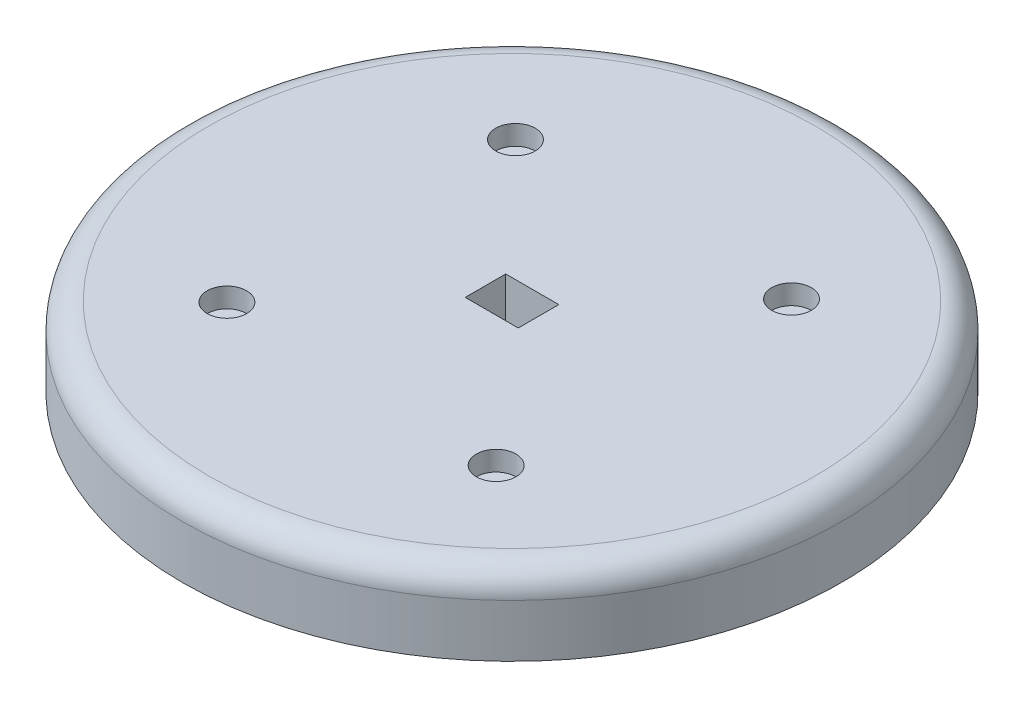
ISO-10303-21;
HEADER;
FILE_DESCRIPTION(('STEP AP214'),'2;1');
FILE_NAME('part.step','',(''),(''),'','','');
FILE_SCHEMA(('AUTOMOTIVE_DESIGN { 1 0 10303 214 1 1 1 1 }'));
ENDSEC;
DATA;
#1=APPLICATION_CONTEXT('core data for automotive mechanical design processes');
#2=APPLICATION_PROTOCOL_DEFINITION('international standard','automotive_design',2000,#1);
#3=PRODUCT_CONTEXT('',#1,'mechanical');
#4=PRODUCT('Part','Part','',(#3));
#5=PRODUCT_RELATED_PRODUCT_CATEGORY('part','',(#4));
#6=PRODUCT_DEFINITION_FORMATION('','',#4);
#7=PRODUCT_DEFINITION_CONTEXT('part definition',#1,'design');
#8=PRODUCT_DEFINITION('design','',#6,#7);
#9=PRODUCT_DEFINITION_SHAPE('','',#8);
#10=(LENGTH_UNIT() NAMED_UNIT(*) SI_UNIT(.MILLI.,.METRE.));
#11=(NAMED_UNIT(*) PLANE_ANGLE_UNIT() SI_UNIT($,.RADIAN.));
#12=(NAMED_UNIT(*) SI_UNIT($,.STERADIAN.) SOLID_ANGLE_UNIT());
#13=UNCERTAINTY_MEASURE_WITH_UNIT(LENGTH_MEASURE(1.E-05),#10,'distance_accuracy_value','');
#14=(GEOMETRIC_REPRESENTATION_CONTEXT(3) GLOBAL_UNCERTAINTY_ASSIGNED_CONTEXT((#13)) GLOBAL_UNIT_ASSIGNED_CONTEXT((#10,
#11,#12)) REPRESENTATION_CONTEXT('',''));
#15=CARTESIAN_POINT('',(0.,0.,0.));
#16=DIRECTION('',(0.,0.,1.));
#17=DIRECTION('',(1.,0.,0.));
#18=AXIS2_PLACEMENT_3D('',#15,#16,#17);
#19=CARTESIAN_POINT('',(0.,8.,0.));
#20=DIRECTION('',(0.,1.,0.));
#21=DIRECTION('',(0.,0.,1.));
#22=AXIS2_PLACEMENT_3D('',#19,#20,#21);
#23=TOROIDAL_SURFACE('',#22,46.,4.);
#24=CARTESIAN_POINT('',(0.,8.,0.));
#25=DIRECTION('',(0.,1.,0.));
#26=DIRECTION('',(0.,0.,1.));
#27=AXIS2_PLACEMENT_3D('',#24,#25,#26);
#28=CIRCLE('',#27,50.);
#29=CARTESIAN_POINT('',(0.,8.,50.));
#30=VERTEX_POINT('',#29);
#31=EDGE_CURVE('E41',#30,#30,#28,.F.);
#32=ORIENTED_EDGE('',*,*,#31,.F.);
#33=EDGE_LOOP('',(#32));
#34=FACE_BOUND('',#33,.T.);
#35=CARTESIAN_POINT('',(0.,12.,0.));
#36=DIRECTION('',(0.,1.,0.));
#37=DIRECTION('',(0.,0.,1.));
#38=AXIS2_PLACEMENT_3D('',#35,#36,#37);
#39=CIRCLE('',#38,46.);
#40=CARTESIAN_POINT('',(0.,12.,46.));
#41=VERTEX_POINT('',#40);
#42=EDGE_CURVE('E11',#41,#41,#39,.T.);
#43=ORIENTED_EDGE('',*,*,#42,.F.);
#44=EDGE_LOOP('',(#43));
#45=FACE_BOUND('',#44,.T.);
#46=ADVANCED_FACE('F34',(#34,#45),#23,.T.);
#47=CARTESIAN_POINT('',(0.,12.,0.));
#48=DIRECTION('',(0.,-1.,0.));
#49=DIRECTION('',(0.,0.,-1.));
#50=AXIS2_PLACEMENT_3D('',#47,#48,#49);
#51=CYLINDRICAL_SURFACE('',#50,50.);
#52=ORIENTED_EDGE('',*,*,#31,.T.);
#53=EDGE_LOOP('',(#52));
#54=FACE_BOUND('',#53,.T.);
#55=CARTESIAN_POINT('',(0.,0.,0.));
#56=DIRECTION('',(0.,1.,0.));
#57=DIRECTION('',(0.,0.,1.));
#58=AXIS2_PLACEMENT_3D('',#55,#56,#57);
#59=CIRCLE('',#58,50.);
#60=CARTESIAN_POINT('',(0.,0.,50.));
#61=VERTEX_POINT('',#60);
#62=EDGE_CURVE('E132',#61,#61,#59,.T.);
#63=ORIENTED_EDGE('',*,*,#62,.T.);
#64=EDGE_LOOP('',(#63));
#65=FACE_BOUND('',#64,.T.);
#66=ADVANCED_FACE('F139',(#54,#65),#51,.T.);
#67=CARTESIAN_POINT('',(0.,12.,0.));
#68=DIRECTION('',(0.,1.,0.));
#69=DIRECTION('',(0.,0.,1.));
#70=AXIS2_PLACEMENT_3D('',#67,#68,#69);
#71=PLANE('',#70);
#72=DIRECTION('',(0.,0.,1.));
#73=VECTOR('',#72,1.);
#74=CARTESIAN_POINT('',(-4.025,12.,3.075));
#75=LINE('',#74,#73);
#76=CARTESIAN_POINT('',(-4.025,12.,-3.075));
#77=VERTEX_POINT('',#76);
#78=CARTESIAN_POINT('',(-4.025,12.,3.075));
#79=VERTEX_POINT('',#78);
#80=EDGE_CURVE('E48',#77,#79,#75,.T.);
#81=ORIENTED_EDGE('',*,*,#80,.F.);
#82=DIRECTION('',(-1.,0.,0.));
#83=VECTOR('',#82,1.);
#84=CARTESIAN_POINT('',(4.025,12.,-3.075));
#85=LINE('',#84,#83);
#86=CARTESIAN_POINT('',(4.025,12.,-3.075));
#87=VERTEX_POINT('',#86);
#88=EDGE_CURVE('E92',#87,#77,#85,.T.);
#89=ORIENTED_EDGE('',*,*,#88,.F.);
#90=DIRECTION('',(0.,0.,-1.));
#91=VECTOR('',#90,1.);
#92=CARTESIAN_POINT('',(4.025,12.,3.075));
#93=LINE('',#92,#91);
#94=CARTESIAN_POINT('',(4.025,12.,3.075));
#95=VERTEX_POINT('',#94);
#96=EDGE_CURVE('E95',#95,#87,#93,.T.);
#97=ORIENTED_EDGE('',*,*,#96,.F.);
#98=DIRECTION('',(1.,0.,0.));
#99=VECTOR('',#98,1.);
#100=CARTESIAN_POINT('',(4.025,12.,3.075));
#101=LINE('',#100,#99);
#102=EDGE_CURVE('E101',#79,#95,#101,.T.);
#103=ORIENTED_EDGE('',*,*,#102,.F.);
#104=EDGE_LOOP('',(#81,#89,#97,#103));
#105=FACE_BOUND('',#104,.T.);
#106=CARTESIAN_POINT('',(-21.4711321766435,12.,21.7806667809511));
#107=DIRECTION('',(0.,1.,0.));
#108=DIRECTION('',(0.,0.,-1.));
#109=AXIS2_PLACEMENT_3D('',#106,#107,#108);
#110=CIRCLE('',#109,3.);
#111=CARTESIAN_POINT('',(-21.4711321766435,12.,18.7806667809511));
#112=VERTEX_POINT('',#111);
#113=EDGE_CURVE('E107',#112,#112,#110,.T.);
#114=ORIENTED_EDGE('',*,*,#113,.F.);
#115=EDGE_LOOP('',(#114));
#116=FACE_BOUND('',#115,.T.);
#117=CARTESIAN_POINT('',(20.399845913389,12.,22.8058561404883));
#118=DIRECTION('',(0.,1.,0.));
#119=DIRECTION('',(0.,0.,1.));
#120=AXIS2_PLACEMENT_3D('',#117,#118,#119);
#121=CIRCLE('',#120,3.);
#122=CARTESIAN_POINT('',(20.399845913389,12.,25.8058561404883));
#123=VERTEX_POINT('',#122);
#124=EDGE_CURVE('E121',#123,#123,#121,.T.);
#125=ORIENTED_EDGE('',*,*,#124,.F.);
#126=EDGE_LOOP('',(#125));
#127=FACE_BOUND('',#126,.T.);
#128=CARTESIAN_POINT('',(20.9417634133261,12.,-21.4669715968214));
#129=DIRECTION('',(0.,1.,0.));
#130=DIRECTION('',(0.,0.,-1.));
#131=AXIS2_PLACEMENT_3D('',#128,#129,#130);
#132=CIRCLE('',#131,3.);
#133=CARTESIAN_POINT('',(20.9417634133261,12.,-24.4669715968214));
#134=VERTEX_POINT('',#133);
#135=EDGE_CURVE('E115',#134,#134,#132,.T.);
#136=ORIENTED_EDGE('',*,*,#135,.F.);
#137=EDGE_LOOP('',(#136));
#138=FACE_BOUND('',#137,.T.);
#139=CARTESIAN_POINT('',(-20.9417634133261,12.,-21.4669715968214));
#140=DIRECTION('',(0.,1.,0.));
#141=DIRECTION('',(0.,0.,1.));
#142=AXIS2_PLACEMENT_3D('',#139,#140,#141);
#143=CIRCLE('',#142,3.);
#144=CARTESIAN_POINT('',(-20.9417634133261,12.,-18.4669715968214));
#145=VERTEX_POINT('',#144);
#146=EDGE_CURVE('E114',#145,#145,#143,.T.);
#147=ORIENTED_EDGE('',*,*,#146,.F.);
#148=EDGE_LOOP('',(#147));
#149=FACE_BOUND('',#148,.T.);
#150=ORIENTED_EDGE('',*,*,#42,.T.);
#151=EDGE_LOOP('',(#150));
#152=FACE_BOUND('',#151,.T.);
#153=ADVANCED_FACE('F146',(#105,#116,#127,#138,#149,#152),#71,.T.);
#154=CARTESIAN_POINT('',(0.,0.,0.));
#155=DIRECTION('',(0.,1.,0.));
#156=DIRECTION('',(0.,0.,1.));
#157=AXIS2_PLACEMENT_3D('',#154,#155,#156);
#158=PLANE('',#157);
#159=DIRECTION('',(-1.,0.,0.));
#160=VECTOR('',#159,1.);
#161=CARTESIAN_POINT('',(4.025,0.,-3.075));
#162=LINE('',#161,#160);
#163=CARTESIAN_POINT('',(4.025,0.,-3.075));
#164=VERTEX_POINT('',#163);
#165=CARTESIAN_POINT('',(-4.025,0.,-3.075));
#166=VERTEX_POINT('',#165);
#167=EDGE_CURVE('E82',#164,#166,#162,.T.);
#168=ORIENTED_EDGE('',*,*,#167,.T.);
#169=DIRECTION('',(0.,0.,1.));
#170=VECTOR('',#169,1.);
#171=CARTESIAN_POINT('',(-4.025,0.,3.075));
#172=LINE('',#171,#170);
#173=CARTESIAN_POINT('',(-4.025,0.,3.075));
#174=VERTEX_POINT('',#173);
#175=EDGE_CURVE('E76',#166,#174,#172,.T.);
#176=ORIENTED_EDGE('',*,*,#175,.T.);
#177=DIRECTION('',(1.,0.,0.));
#178=VECTOR('',#177,1.);
#179=CARTESIAN_POINT('',(4.025,0.,3.075));
#180=LINE('',#179,#178);
#181=CARTESIAN_POINT('',(4.025,0.,3.075));
#182=VERTEX_POINT('',#181);
#183=EDGE_CURVE('E85',#174,#182,#180,.T.);
#184=ORIENTED_EDGE('',*,*,#183,.T.);
#185=DIRECTION('',(0.,0.,-1.));
#186=VECTOR('',#185,1.);
#187=CARTESIAN_POINT('',(4.025,0.,3.075));
#188=LINE('',#187,#186);
#189=EDGE_CURVE('E56',#182,#164,#188,.T.);
#190=ORIENTED_EDGE('',*,*,#189,.T.);
#191=EDGE_LOOP('',(#168,#176,#184,#190));
#192=FACE_BOUND('',#191,.T.);
#193=ORIENTED_EDGE('',*,*,#62,.F.);
#194=EDGE_LOOP('',(#193));
#195=FACE_BOUND('',#194,.T.);
#196=ADVANCED_FACE('F89',(#192,#195),#158,.F.);
#197=CARTESIAN_POINT('',(-20.9417634133261,9.,-21.4669715968214));
#198=DIRECTION('',(0.,1.,0.));
#199=DIRECTION('',(0.,0.,1.));
#200=AXIS2_PLACEMENT_3D('',#197,#198,#199);
#201=CYLINDRICAL_SURFACE('',#200,3.);
#202=CARTESIAN_POINT('',(-20.9417634133261,9.,-21.4669715968214));
#203=DIRECTION('',(0.,1.,0.));
#204=DIRECTION('',(0.,0.,1.));
#205=AXIS2_PLACEMENT_3D('',#202,#203,#204);
#206=CIRCLE('',#205,3.);
#207=CARTESIAN_POINT('',(-20.9417634133261,9.,-18.4669715968214));
#208=VERTEX_POINT('',#207);
#209=EDGE_CURVE('E129',#208,#208,#206,.T.);
#210=ORIENTED_EDGE('',*,*,#209,.F.);
#211=EDGE_LOOP('',(#210));
#212=FACE_BOUND('',#211,.T.);
#213=ORIENTED_EDGE('',*,*,#146,.T.);
#214=EDGE_LOOP('',(#213));
#215=FACE_BOUND('',#214,.T.);
#216=ADVANCED_FACE('F154',(#212,#215),#201,.F.);
#217=CARTESIAN_POINT('',(-20.9417634133261,9.,-21.4669715968214));
#218=DIRECTION('',(0.,1.,0.));
#219=DIRECTION('',(0.,0.,1.));
#220=AXIS2_PLACEMENT_3D('',#217,#218,#219);
#221=PLANE('',#220);
#222=ORIENTED_EDGE('',*,*,#209,.T.);
#223=EDGE_LOOP('',(#222));
#224=FACE_BOUND('',#223,.T.);
#225=ADVANCED_FACE('F160',(#224),#221,.T.);
#226=CARTESIAN_POINT('',(20.9417634133261,9.,-21.4669715968214));
#227=DIRECTION('',(0.,1.,0.));
#228=DIRECTION('',(0.,0.,1.));
#229=AXIS2_PLACEMENT_3D('',#226,#227,#228);
#230=CYLINDRICAL_SURFACE('',#229,3.);
#231=CARTESIAN_POINT('',(20.9417634133261,9.,-21.4669715968214));
#232=DIRECTION('',(0.,1.,0.));
#233=DIRECTION('',(0.,0.,-1.));
#234=AXIS2_PLACEMENT_3D('',#231,#232,#233);
#235=CIRCLE('',#234,3.);
#236=CARTESIAN_POINT('',(20.9417634133261,9.,-24.4669715968214));
#237=VERTEX_POINT('',#236);
#238=EDGE_CURVE('E111',#237,#237,#235,.T.);
#239=ORIENTED_EDGE('',*,*,#238,.F.);
#240=EDGE_LOOP('',(#239));
#241=FACE_BOUND('',#240,.T.);
#242=ORIENTED_EDGE('',*,*,#135,.T.);
#243=EDGE_LOOP('',(#242));
#244=FACE_BOUND('',#243,.T.);
#245=ADVANCED_FACE('F164',(#241,#244),#230,.F.);
#246=CARTESIAN_POINT('',(20.9417634133261,9.,-21.4669715968214));
#247=DIRECTION('',(0.,-1.,0.));
#248=DIRECTION('',(0.,0.,-1.));
#249=AXIS2_PLACEMENT_3D('',#246,#247,#248);
#250=PLANE('',#249);
#251=ORIENTED_EDGE('',*,*,#238,.T.);
#252=EDGE_LOOP('',(#251));
#253=FACE_BOUND('',#252,.T.);
#254=ADVANCED_FACE('F178',(#253),#250,.F.);
#255=CARTESIAN_POINT('',(20.399845913389,9.,22.8058561404883));
#256=DIRECTION('',(0.,1.,0.));
#257=DIRECTION('',(0.,0.,1.));
#258=AXIS2_PLACEMENT_3D('',#255,#256,#257);
#259=CYLINDRICAL_SURFACE('',#258,3.);
#260=CARTESIAN_POINT('',(20.399845913389,9.,22.8058561404883));
#261=DIRECTION('',(0.,1.,0.));
#262=DIRECTION('',(0.,0.,1.));
#263=AXIS2_PLACEMENT_3D('',#260,#261,#262);
#264=CIRCLE('',#263,3.);
#265=CARTESIAN_POINT('',(20.399845913389,9.,25.8058561404883));
#266=VERTEX_POINT('',#265);
#267=EDGE_CURVE('E118',#266,#266,#264,.T.);
#268=ORIENTED_EDGE('',*,*,#267,.F.);
#269=EDGE_LOOP('',(#268));
#270=FACE_BOUND('',#269,.T.);
#271=ORIENTED_EDGE('',*,*,#124,.T.);
#272=EDGE_LOOP('',(#271));
#273=FACE_BOUND('',#272,.T.);
#274=ADVANCED_FACE('F175',(#270,#273),#259,.F.);
#275=CARTESIAN_POINT('',(20.399845913389,9.,22.8058561404883));
#276=DIRECTION('',(0.,1.,0.));
#277=DIRECTION('',(0.,0.,1.));
#278=AXIS2_PLACEMENT_3D('',#275,#276,#277);
#279=PLANE('',#278);
#280=ORIENTED_EDGE('',*,*,#267,.T.);
#281=EDGE_LOOP('',(#280));
#282=FACE_BOUND('',#281,.T.);
#283=ADVANCED_FACE('F170',(#282),#279,.T.);
#284=CARTESIAN_POINT('',(-21.4711321766435,9.,21.7806667809511));
#285=DIRECTION('',(0.,1.,0.));
#286=DIRECTION('',(0.,0.,1.));
#287=AXIS2_PLACEMENT_3D('',#284,#285,#286);
#288=CYLINDRICAL_SURFACE('',#287,3.);
#289=CARTESIAN_POINT('',(-21.4711321766435,9.,21.7806667809511));
#290=DIRECTION('',(0.,1.,0.));
#291=DIRECTION('',(0.,0.,-1.));
#292=AXIS2_PLACEMENT_3D('',#289,#290,#291);
#293=CIRCLE('',#292,3.);
#294=CARTESIAN_POINT('',(-21.4711321766435,9.,18.7806667809511));
#295=VERTEX_POINT('',#294);
#296=EDGE_CURVE('E124',#295,#295,#293,.T.);
#297=ORIENTED_EDGE('',*,*,#296,.F.);
#298=EDGE_LOOP('',(#297));
#299=FACE_BOUND('',#298,.T.);
#300=ORIENTED_EDGE('',*,*,#113,.T.);
#301=EDGE_LOOP('',(#300));
#302=FACE_BOUND('',#301,.T.);
#303=ADVANCED_FACE('F166',(#299,#302),#288,.F.);
#304=CARTESIAN_POINT('',(-21.4711321766435,9.,21.7806667809511));
#305=DIRECTION('',(0.,-1.,0.));
#306=DIRECTION('',(0.,0.,-1.));
#307=AXIS2_PLACEMENT_3D('',#304,#305,#306);
#308=PLANE('',#307);
#309=ORIENTED_EDGE('',*,*,#296,.T.);
#310=EDGE_LOOP('',(#309));
#311=FACE_BOUND('',#310,.T.);
#312=ADVANCED_FACE('F169',(#311),#308,.F.);
#313=CARTESIAN_POINT('',(-4.025,0.,3.075));
#314=DIRECTION('',(-1.,0.,0.));
#315=DIRECTION('',(0.,0.,1.));
#316=AXIS2_PLACEMENT_3D('',#313,#314,#315);
#317=PLANE('',#316);
#318=ORIENTED_EDGE('',*,*,#80,.T.);
#319=DIRECTION('',(0.,1.,0.));
#320=VECTOR('',#319,1.);
#321=CARTESIAN_POINT('',(-4.025,0.,3.075));
#322=LINE('',#321,#320);
#323=EDGE_CURVE('E72',#174,#79,#322,.T.);
#324=ORIENTED_EDGE('',*,*,#323,.F.);
#325=ORIENTED_EDGE('',*,*,#175,.F.);
#326=DIRECTION('',(0.,1.,0.));
#327=VECTOR('',#326,1.);
#328=CARTESIAN_POINT('',(-4.025,0.,-3.075));
#329=LINE('',#328,#327);
#330=EDGE_CURVE('E105',#166,#77,#329,.T.);
#331=ORIENTED_EDGE('',*,*,#330,.T.);
#332=EDGE_LOOP('',(#318,#324,#325,#331));
#333=FACE_BOUND('',#332,.T.);
#334=ADVANCED_FACE('F74',(#333),#317,.F.);
#335=CARTESIAN_POINT('',(4.025,0.,-3.075));
#336=DIRECTION('',(0.,0.,-1.));
#337=DIRECTION('',(-1.,0.,0.));
#338=AXIS2_PLACEMENT_3D('',#335,#336,#337);
#339=PLANE('',#338);
#340=ORIENTED_EDGE('',*,*,#88,.T.);
#341=ORIENTED_EDGE('',*,*,#330,.F.);
#342=ORIENTED_EDGE('',*,*,#167,.F.);
#343=DIRECTION('',(0.,1.,0.));
#344=VECTOR('',#343,1.);
#345=CARTESIAN_POINT('',(4.025,0.,-3.075));
#346=LINE('',#345,#344);
#347=EDGE_CURVE('E108',#164,#87,#346,.T.);
#348=ORIENTED_EDGE('',*,*,#347,.T.);
#349=EDGE_LOOP('',(#340,#341,#342,#348));
#350=FACE_BOUND('',#349,.T.);
#351=ADVANCED_FACE('F191',(#350),#339,.F.);
#352=CARTESIAN_POINT('',(4.025,0.,3.075));
#353=DIRECTION('',(1.,0.,0.));
#354=DIRECTION('',(0.,0.,-1.));
#355=AXIS2_PLACEMENT_3D('',#352,#353,#354);
#356=PLANE('',#355);
#357=ORIENTED_EDGE('',*,*,#96,.T.);
#358=ORIENTED_EDGE('',*,*,#347,.F.);
#359=ORIENTED_EDGE('',*,*,#189,.F.);
#360=DIRECTION('',(0.,1.,0.));
#361=VECTOR('',#360,1.);
#362=CARTESIAN_POINT('',(4.025,0.,3.075));
#363=LINE('',#362,#361);
#364=EDGE_CURVE('E81',#182,#95,#363,.T.);
#365=ORIENTED_EDGE('',*,*,#364,.T.);
#366=EDGE_LOOP('',(#357,#358,#359,#365));
#367=FACE_BOUND('',#366,.T.);
#368=ADVANCED_FACE('F194',(#367),#356,.F.);
#369=CARTESIAN_POINT('',(4.025,0.,3.075));
#370=DIRECTION('',(0.,0.,1.));
#371=DIRECTION('',(1.,0.,0.));
#372=AXIS2_PLACEMENT_3D('',#369,#370,#371);
#373=PLANE('',#372);
#374=ORIENTED_EDGE('',*,*,#102,.T.);
#375=ORIENTED_EDGE('',*,*,#364,.F.);
#376=ORIENTED_EDGE('',*,*,#183,.F.);
#377=ORIENTED_EDGE('',*,*,#323,.T.);
#378=EDGE_LOOP('',(#374,#375,#376,#377));
#379=FACE_BOUND('',#378,.T.);
#380=ADVANCED_FACE('F86',(#379),#373,.F.);
#381=CLOSED_SHELL('',(#46,#66,#153,#196,#216,#225,#245,#254,#274,#283,#303,#312,#334,#351,#368,#380));
#382=MANIFOLD_SOLID_BREP('B2',#381);
#383=ADVANCED_BREP_SHAPE_REPRESENTATION('',(#18,#382),#14);
#384=SHAPE_DEFINITION_REPRESENTATION(#9,#383);
ENDSEC;
END-ISO-10303-21;
